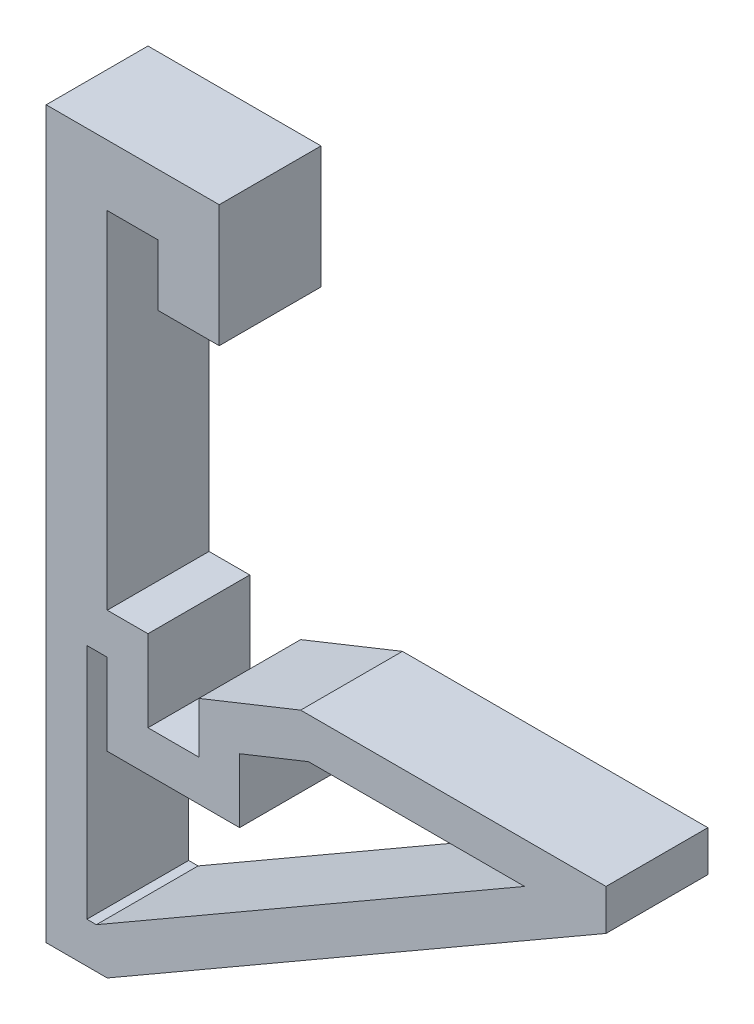
ISO-10303-21;
HEADER;
FILE_DESCRIPTION(('STEP AP214'),'2;1');
FILE_NAME('part.step','',(''),(''),'','','');
FILE_SCHEMA(('AUTOMOTIVE_DESIGN { 1 0 10303 214 1 1 1 1 }'));
ENDSEC;
DATA;
#1=APPLICATION_CONTEXT('core data for automotive mechanical design processes');
#2=APPLICATION_PROTOCOL_DEFINITION('international standard','automotive_design',2000,#1);
#3=PRODUCT_CONTEXT('',#1,'mechanical');
#4=PRODUCT('Part','Part','',(#3));
#5=PRODUCT_RELATED_PRODUCT_CATEGORY('part','',(#4));
#6=PRODUCT_DEFINITION_FORMATION('','',#4);
#7=PRODUCT_DEFINITION_CONTEXT('part definition',#1,'design');
#8=PRODUCT_DEFINITION('design','',#6,#7);
#9=PRODUCT_DEFINITION_SHAPE('','',#8);
#10=(LENGTH_UNIT() NAMED_UNIT(*) SI_UNIT(.MILLI.,.METRE.));
#11=(NAMED_UNIT(*) PLANE_ANGLE_UNIT() SI_UNIT($,.RADIAN.));
#12=(NAMED_UNIT(*) SI_UNIT($,.STERADIAN.) SOLID_ANGLE_UNIT());
#13=UNCERTAINTY_MEASURE_WITH_UNIT(LENGTH_MEASURE(1.E-05),#10,'distance_accuracy_value','');
#14=(GEOMETRIC_REPRESENTATION_CONTEXT(3) GLOBAL_UNCERTAINTY_ASSIGNED_CONTEXT((#13)) GLOBAL_UNIT_ASSIGNED_CONTEXT((#10,
#11,#12)) REPRESENTATION_CONTEXT('',''));
#15=CARTESIAN_POINT('',(0.,0.,0.));
#16=DIRECTION('',(0.,0.,1.));
#17=DIRECTION('',(1.,0.,0.));
#18=AXIS2_PLACEMENT_3D('',#15,#16,#17);
#19=CARTESIAN_POINT('',(0.,0.,5.));
#20=DIRECTION('',(0.,1.,0.));
#21=DIRECTION('',(-1.,0.,0.));
#22=AXIS2_PLACEMENT_3D('',#19,#20,#21);
#23=PLANE('',#22);
#24=DIRECTION('',(1.,0.,0.));
#25=VECTOR('',#24,1.);
#26=CARTESIAN_POINT('',(0.,0.,0.));
#27=LINE('',#26,#25);
#28=CARTESIAN_POINT('',(0.,0.,0.));
#29=VERTEX_POINT('',#28);
#30=CARTESIAN_POINT('',(3.00000000000006,-1.10561049686488E-13,0.));
#31=VERTEX_POINT('',#30);
#32=EDGE_CURVE('E264',#29,#31,#27,.T.);
#33=ORIENTED_EDGE('',*,*,#32,.T.);
#34=DIRECTION('',(0.,0.,-1.));
#35=VECTOR('',#34,1.);
#36=CARTESIAN_POINT('',(3.00000000000006,-1.10561049686488E-13,5.));
#37=LINE('',#36,#35);
#38=CARTESIAN_POINT('',(3.00000000000006,-1.10561049686488E-13,5.));
#39=VERTEX_POINT('',#38);
#40=EDGE_CURVE('E11',#39,#31,#37,.T.);
#41=ORIENTED_EDGE('',*,*,#40,.F.);
#42=DIRECTION('',(1.,0.,0.));
#43=VECTOR('',#42,1.);
#44=CARTESIAN_POINT('',(0.,0.,5.));
#45=LINE('',#44,#43);
#46=CARTESIAN_POINT('',(0.,0.,5.));
#47=VERTEX_POINT('',#46);
#48=EDGE_CURVE('E278',#47,#39,#45,.T.);
#49=ORIENTED_EDGE('',*,*,#48,.F.);
#50=DIRECTION('',(0.,0.,-1.));
#51=VECTOR('',#50,1.);
#52=CARTESIAN_POINT('',(0.,0.,5.));
#53=LINE('',#52,#51);
#54=EDGE_CURVE('E312',#47,#29,#53,.T.);
#55=ORIENTED_EDGE('',*,*,#54,.T.);
#56=EDGE_LOOP('',(#33,#41,#49,#55));
#57=FACE_BOUND('',#56,.T.);
#58=ADVANCED_FACE('F35',(#57),#23,.F.);
#59=CARTESIAN_POINT('',(3.00000000000006,-1.10561049686488E-13,5.));
#60=DIRECTION('',(-0.499999999999998,0.86602540378444,0.));
#61=DIRECTION('',(-0.86602540378444,-0.499999999999998,0.));
#62=AXIS2_PLACEMENT_3D('',#59,#60,#61);
#63=PLANE('',#62);
#64=DIRECTION('',(0.86602540378444,0.499999999999998,0.));
#65=VECTOR('',#64,1.);
#66=CARTESIAN_POINT('',(3.00000000000006,-1.10561049686488E-13,0.));
#67=LINE('',#66,#65);
#68=CARTESIAN_POINT('',(27.5000000000001,14.1450815951456,0.));
#69=VERTEX_POINT('',#68);
#70=EDGE_CURVE('E315',#31,#69,#67,.T.);
#71=ORIENTED_EDGE('',*,*,#70,.T.);
#72=DIRECTION('',(0.,0.,-1.));
#73=VECTOR('',#72,1.);
#74=CARTESIAN_POINT('',(27.5000000000001,14.1450815951456,5.));
#75=LINE('',#74,#73);
#76=CARTESIAN_POINT('',(27.5000000000001,14.1450815951456,5.));
#77=VERTEX_POINT('',#76);
#78=EDGE_CURVE('E42',#77,#69,#75,.T.);
#79=ORIENTED_EDGE('',*,*,#78,.F.);
#80=DIRECTION('',(0.86602540378444,0.499999999999998,0.));
#81=VECTOR('',#80,1.);
#82=CARTESIAN_POINT('',(3.00000000000006,-1.10561049686488E-13,5.));
#83=LINE('',#82,#81);
#84=EDGE_CURVE('E281',#39,#77,#83,.T.);
#85=ORIENTED_EDGE('',*,*,#84,.F.);
#86=ORIENTED_EDGE('',*,*,#40,.T.);
#87=EDGE_LOOP('',(#71,#79,#85,#86));
#88=FACE_BOUND('',#87,.T.);
#89=ADVANCED_FACE('F410',(#88),#63,.F.);
#90=CARTESIAN_POINT('',(27.5000000000001,16.1450815951456,5.));
#91=DIRECTION('',(-1.,0.,0.));
#92=DIRECTION('',(0.,0.,1.));
#93=AXIS2_PLACEMENT_3D('',#90,#91,#92);
#94=PLANE('',#93);
#95=DIRECTION('',(0.,1.,0.));
#96=VECTOR('',#95,1.);
#97=CARTESIAN_POINT('',(27.5000000000001,16.1450815951456,0.));
#98=LINE('',#97,#96);
#99=CARTESIAN_POINT('',(27.5000000000001,16.1450815951456,0.));
#100=VERTEX_POINT('',#99);
#101=EDGE_CURVE('E317',#69,#100,#98,.T.);
#102=ORIENTED_EDGE('',*,*,#101,.T.);
#103=DIRECTION('',(0.,0.,-1.));
#104=VECTOR('',#103,1.);
#105=CARTESIAN_POINT('',(27.5000000000001,16.1450815951456,5.));
#106=LINE('',#105,#104);
#107=CARTESIAN_POINT('',(27.5000000000001,16.1450815951456,5.));
#108=VERTEX_POINT('',#107);
#109=EDGE_CURVE('E382',#108,#100,#106,.T.);
#110=ORIENTED_EDGE('',*,*,#109,.F.);
#111=DIRECTION('',(0.,1.,0.));
#112=VECTOR('',#111,1.);
#113=CARTESIAN_POINT('',(27.5000000000001,16.1450815951456,5.));
#114=LINE('',#113,#112);
#115=EDGE_CURVE('E284',#77,#108,#114,.T.);
#116=ORIENTED_EDGE('',*,*,#115,.F.);
#117=ORIENTED_EDGE('',*,*,#78,.T.);
#118=EDGE_LOOP('',(#102,#110,#116,#117));
#119=FACE_BOUND('',#118,.T.);
#120=ADVANCED_FACE('F389',(#119),#94,.F.);
#121=CARTESIAN_POINT('',(27.5000000000001,16.1450815951456,5.));
#122=DIRECTION('',(0.,-1.,0.));
#123=DIRECTION('',(1.,0.,0.));
#124=AXIS2_PLACEMENT_3D('',#121,#122,#123);
#125=PLANE('',#124);
#126=DIRECTION('',(-1.,0.,0.));
#127=VECTOR('',#126,1.);
#128=CARTESIAN_POINT('',(27.5000000000001,16.1450815951456,0.));
#129=LINE('',#128,#127);
#130=CARTESIAN_POINT('',(12.5000000000001,16.1450815951468,0.));
#131=VERTEX_POINT('',#130);
#132=EDGE_CURVE('E319',#100,#131,#129,.T.);
#133=ORIENTED_EDGE('',*,*,#132,.T.);
#134=DIRECTION('',(0.,0.,-1.));
#135=VECTOR('',#134,1.);
#136=CARTESIAN_POINT('',(12.5000000000001,16.1450815951468,5.));
#137=LINE('',#136,#135);
#138=CARTESIAN_POINT('',(12.5000000000001,16.1450815951468,5.));
#139=VERTEX_POINT('',#138);
#140=EDGE_CURVE('E379',#139,#131,#137,.T.);
#141=ORIENTED_EDGE('',*,*,#140,.F.);
#142=DIRECTION('',(-1.,0.,0.));
#143=VECTOR('',#142,1.);
#144=CARTESIAN_POINT('',(27.5000000000001,16.1450815951456,5.));
#145=LINE('',#144,#143);
#146=EDGE_CURVE('E286',#108,#139,#145,.T.);
#147=ORIENTED_EDGE('',*,*,#146,.F.);
#148=ORIENTED_EDGE('',*,*,#109,.T.);
#149=EDGE_LOOP('',(#133,#141,#147,#148));
#150=FACE_BOUND('',#149,.T.);
#151=ADVANCED_FACE('F398',(#150),#125,.F.);
#152=CARTESIAN_POINT('',(12.5000000000001,16.1450815951468,5.));
#153=DIRECTION('',(0.371390676354282,-0.928476690885188,0.));
#154=DIRECTION('',(0.928476690885188,0.371390676354282,0.));
#155=AXIS2_PLACEMENT_3D('',#152,#153,#154);
#156=PLANE('',#155);
#157=DIRECTION('',(-0.928476690885188,-0.371390676354282,0.));
#158=VECTOR('',#157,1.);
#159=CARTESIAN_POINT('',(12.5000000000001,16.1450815951468,0.));
#160=LINE('',#159,#158);
#161=CARTESIAN_POINT('',(7.50000000000005,14.1450815951457,0.));
#162=VERTEX_POINT('',#161);
#163=EDGE_CURVE('E321',#131,#162,#160,.T.);
#164=ORIENTED_EDGE('',*,*,#163,.T.);
#165=DIRECTION('',(0.,0.,-1.));
#166=VECTOR('',#165,1.);
#167=CARTESIAN_POINT('',(7.50000000000005,14.1450815951457,5.));
#168=LINE('',#167,#166);
#169=CARTESIAN_POINT('',(7.50000000000005,14.1450815951457,5.));
#170=VERTEX_POINT('',#169);
#171=EDGE_CURVE('E376',#170,#162,#168,.T.);
#172=ORIENTED_EDGE('',*,*,#171,.F.);
#173=DIRECTION('',(-0.928476690885188,-0.371390676354282,0.));
#174=VECTOR('',#173,1.);
#175=CARTESIAN_POINT('',(12.5000000000001,16.1450815951468,5.));
#176=LINE('',#175,#174);
#177=EDGE_CURVE('E288',#139,#170,#176,.T.);
#178=ORIENTED_EDGE('',*,*,#177,.F.);
#179=ORIENTED_EDGE('',*,*,#140,.T.);
#180=EDGE_LOOP('',(#164,#172,#178,#179));
#181=FACE_BOUND('',#180,.T.);
#182=ADVANCED_FACE('F402',(#181),#156,.F.);
#183=CARTESIAN_POINT('',(7.50000000000005,14.1450815951457,5.));
#184=DIRECTION('',(1.,0.,0.));
#185=DIRECTION('',(0.,0.,-1.));
#186=AXIS2_PLACEMENT_3D('',#183,#184,#185);
#187=PLANE('',#186);
#188=DIRECTION('',(0.,-1.,0.));
#189=VECTOR('',#188,1.);
#190=CARTESIAN_POINT('',(7.50000000000005,14.1450815951457,0.));
#191=LINE('',#190,#189);
#192=CARTESIAN_POINT('',(7.50000000000005,11.6450815951457,0.));
#193=VERTEX_POINT('',#192);
#194=EDGE_CURVE('E323',#162,#193,#191,.T.);
#195=ORIENTED_EDGE('',*,*,#194,.T.);
#196=DIRECTION('',(0.,0.,-1.));
#197=VECTOR('',#196,1.);
#198=CARTESIAN_POINT('',(7.50000000000005,11.6450815951457,5.));
#199=LINE('',#198,#197);
#200=CARTESIAN_POINT('',(7.50000000000005,11.6450815951457,5.));
#201=VERTEX_POINT('',#200);
#202=EDGE_CURVE('E373',#201,#193,#199,.T.);
#203=ORIENTED_EDGE('',*,*,#202,.F.);
#204=DIRECTION('',(0.,-1.,0.));
#205=VECTOR('',#204,1.);
#206=CARTESIAN_POINT('',(7.50000000000005,14.1450815951457,5.));
#207=LINE('',#206,#205);
#208=EDGE_CURVE('E290',#170,#201,#207,.T.);
#209=ORIENTED_EDGE('',*,*,#208,.F.);
#210=ORIENTED_EDGE('',*,*,#171,.T.);
#211=EDGE_LOOP('',(#195,#203,#209,#210));
#212=FACE_BOUND('',#211,.T.);
#213=ADVANCED_FACE('F463',(#212),#187,.F.);
#214=CARTESIAN_POINT('',(7.50000000000005,11.6450815951457,5.));
#215=DIRECTION('',(0.,-1.,0.));
#216=DIRECTION('',(0.,0.,-1.));
#217=AXIS2_PLACEMENT_3D('',#214,#215,#216);
#218=PLANE('',#217);
#219=DIRECTION('',(-1.,0.,0.));
#220=VECTOR('',#219,1.);
#221=CARTESIAN_POINT('',(7.50000000000005,11.6450815951457,0.));
#222=LINE('',#221,#220);
#223=CARTESIAN_POINT('',(5.00000000000005,11.6450815951457,0.));
#224=VERTEX_POINT('',#223);
#225=EDGE_CURVE('E325',#193,#224,#222,.T.);
#226=ORIENTED_EDGE('',*,*,#225,.T.);
#227=DIRECTION('',(0.,0.,-1.));
#228=VECTOR('',#227,1.);
#229=CARTESIAN_POINT('',(5.00000000000005,11.6450815951457,5.));
#230=LINE('',#229,#228);
#231=CARTESIAN_POINT('',(5.00000000000005,11.6450815951457,5.));
#232=VERTEX_POINT('',#231);
#233=EDGE_CURVE('E370',#232,#224,#230,.T.);
#234=ORIENTED_EDGE('',*,*,#233,.F.);
#235=DIRECTION('',(-1.,0.,0.));
#236=VECTOR('',#235,1.);
#237=CARTESIAN_POINT('',(7.50000000000005,11.6450815951457,5.));
#238=LINE('',#237,#236);
#239=EDGE_CURVE('E292',#201,#232,#238,.T.);
#240=ORIENTED_EDGE('',*,*,#239,.F.);
#241=ORIENTED_EDGE('',*,*,#202,.T.);
#242=EDGE_LOOP('',(#226,#234,#240,#241));
#243=FACE_BOUND('',#242,.T.);
#244=ADVANCED_FACE('F460',(#243),#218,.F.);
#245=CARTESIAN_POINT('',(5.00000000000005,11.6450815951457,5.));
#246=DIRECTION('',(-1.,0.,0.));
#247=DIRECTION('',(0.,-1.,0.));
#248=AXIS2_PLACEMENT_3D('',#245,#246,#247);
#249=PLANE('',#248);
#250=DIRECTION('',(0.,1.,0.));
#251=VECTOR('',#250,1.);
#252=CARTESIAN_POINT('',(5.00000000000005,11.6450815951457,0.));
#253=LINE('',#252,#251);
#254=CARTESIAN_POINT('',(5.00000000000005,15.6450815951457,0.));
#255=VERTEX_POINT('',#254);
#256=EDGE_CURVE('E327',#224,#255,#253,.T.);
#257=ORIENTED_EDGE('',*,*,#256,.T.);
#258=DIRECTION('',(0.,0.,-1.));
#259=VECTOR('',#258,1.);
#260=CARTESIAN_POINT('',(5.00000000000005,15.6450815951457,5.));
#261=LINE('',#260,#259);
#262=CARTESIAN_POINT('',(5.00000000000005,15.6450815951457,5.));
#263=VERTEX_POINT('',#262);
#264=EDGE_CURVE('E367',#263,#255,#261,.T.);
#265=ORIENTED_EDGE('',*,*,#264,.F.);
#266=DIRECTION('',(0.,1.,0.));
#267=VECTOR('',#266,1.);
#268=CARTESIAN_POINT('',(5.00000000000005,11.6450815951457,5.));
#269=LINE('',#268,#267);
#270=EDGE_CURVE('E294',#232,#263,#269,.T.);
#271=ORIENTED_EDGE('',*,*,#270,.F.);
#272=ORIENTED_EDGE('',*,*,#233,.T.);
#273=EDGE_LOOP('',(#257,#265,#271,#272));
#274=FACE_BOUND('',#273,.T.);
#275=ADVANCED_FACE('F456',(#274),#249,.F.);
#276=CARTESIAN_POINT('',(5.00000000000005,15.6450815951457,5.));
#277=DIRECTION('',(0.,-1.,0.));
#278=DIRECTION('',(0.,0.,-1.));
#279=AXIS2_PLACEMENT_3D('',#276,#277,#278);
#280=PLANE('',#279);
#281=DIRECTION('',(-1.,0.,0.));
#282=VECTOR('',#281,1.);
#283=CARTESIAN_POINT('',(5.00000000000005,15.6450815951457,0.));
#284=LINE('',#283,#282);
#285=CARTESIAN_POINT('',(3.00000000000005,15.6450815951457,0.));
#286=VERTEX_POINT('',#285);
#287=EDGE_CURVE('E329',#255,#286,#284,.T.);
#288=ORIENTED_EDGE('',*,*,#287,.T.);
#289=DIRECTION('',(0.,0.,-1.));
#290=VECTOR('',#289,1.);
#291=CARTESIAN_POINT('',(3.00000000000005,15.6450815951457,5.));
#292=LINE('',#291,#290);
#293=CARTESIAN_POINT('',(3.00000000000005,15.6450815951457,5.));
#294=VERTEX_POINT('',#293);
#295=EDGE_CURVE('E364',#294,#286,#292,.T.);
#296=ORIENTED_EDGE('',*,*,#295,.F.);
#297=DIRECTION('',(-1.,0.,0.));
#298=VECTOR('',#297,1.);
#299=CARTESIAN_POINT('',(5.00000000000005,15.6450815951457,5.));
#300=LINE('',#299,#298);
#301=EDGE_CURVE('E296',#263,#294,#300,.T.);
#302=ORIENTED_EDGE('',*,*,#301,.F.);
#303=ORIENTED_EDGE('',*,*,#264,.T.);
#304=EDGE_LOOP('',(#288,#296,#302,#303));
#305=FACE_BOUND('',#304,.T.);
#306=ADVANCED_FACE('F452',(#305),#280,.F.);
#307=CARTESIAN_POINT('',(3.00000000000005,32.6450815951457,5.));
#308=DIRECTION('',(-1.,0.,0.));
#309=DIRECTION('',(0.,-1.,0.));
#310=AXIS2_PLACEMENT_3D('',#307,#308,#309);
#311=PLANE('',#310);
#312=DIRECTION('',(0.,1.,0.));
#313=VECTOR('',#312,1.);
#314=CARTESIAN_POINT('',(3.00000000000005,32.6450815951457,0.));
#315=LINE('',#314,#313);
#316=CARTESIAN_POINT('',(3.00000000000005,32.6450815951457,0.));
#317=VERTEX_POINT('',#316);
#318=EDGE_CURVE('E331',#286,#317,#315,.T.);
#319=ORIENTED_EDGE('',*,*,#318,.T.);
#320=DIRECTION('',(0.,0.,-1.));
#321=VECTOR('',#320,1.);
#322=CARTESIAN_POINT('',(3.00000000000005,32.6450815951457,5.));
#323=LINE('',#322,#321);
#324=CARTESIAN_POINT('',(3.00000000000005,32.6450815951457,5.));
#325=VERTEX_POINT('',#324);
#326=EDGE_CURVE('E361',#325,#317,#323,.T.);
#327=ORIENTED_EDGE('',*,*,#326,.F.);
#328=DIRECTION('',(0.,1.,0.));
#329=VECTOR('',#328,1.);
#330=CARTESIAN_POINT('',(3.00000000000005,32.6450815951457,5.));
#331=LINE('',#330,#329);
#332=EDGE_CURVE('E298',#294,#325,#331,.T.);
#333=ORIENTED_EDGE('',*,*,#332,.F.);
#334=ORIENTED_EDGE('',*,*,#295,.T.);
#335=EDGE_LOOP('',(#319,#327,#333,#334));
#336=FACE_BOUND('',#335,.T.);
#337=ADVANCED_FACE('F447',(#336),#311,.F.);
#338=CARTESIAN_POINT('',(5.50000000000006,32.6450815951457,5.));
#339=DIRECTION('',(0.,1.,0.));
#340=DIRECTION('',(0.,0.,1.));
#341=AXIS2_PLACEMENT_3D('',#338,#339,#340);
#342=PLANE('',#341);
#343=DIRECTION('',(1.,0.,0.));
#344=VECTOR('',#343,1.);
#345=CARTESIAN_POINT('',(5.50000000000006,32.6450815951457,0.));
#346=LINE('',#345,#344);
#347=CARTESIAN_POINT('',(5.50000000000006,32.6450815951457,0.));
#348=VERTEX_POINT('',#347);
#349=EDGE_CURVE('E333',#317,#348,#346,.T.);
#350=ORIENTED_EDGE('',*,*,#349,.T.);
#351=DIRECTION('',(0.,0.,-1.));
#352=VECTOR('',#351,1.);
#353=CARTESIAN_POINT('',(5.50000000000006,32.6450815951457,5.));
#354=LINE('',#353,#352);
#355=CARTESIAN_POINT('',(5.50000000000006,32.6450815951457,5.));
#356=VERTEX_POINT('',#355);
#357=EDGE_CURVE('E358',#356,#348,#354,.T.);
#358=ORIENTED_EDGE('',*,*,#357,.F.);
#359=DIRECTION('',(1.,0.,0.));
#360=VECTOR('',#359,1.);
#361=CARTESIAN_POINT('',(5.50000000000006,32.6450815951457,5.));
#362=LINE('',#361,#360);
#363=EDGE_CURVE('E300',#325,#356,#362,.T.);
#364=ORIENTED_EDGE('',*,*,#363,.F.);
#365=ORIENTED_EDGE('',*,*,#326,.T.);
#366=EDGE_LOOP('',(#350,#358,#364,#365));
#367=FACE_BOUND('',#366,.T.);
#368=ADVANCED_FACE('F441',(#367),#342,.F.);
#369=CARTESIAN_POINT('',(5.50000000000005,29.6450815951457,5.));
#370=DIRECTION('',(1.,0.,0.));
#371=DIRECTION('',(0.,1.,0.));
#372=AXIS2_PLACEMENT_3D('',#369,#370,#371);
#373=PLANE('',#372);
#374=DIRECTION('',(0.,-1.,0.));
#375=VECTOR('',#374,1.);
#376=CARTESIAN_POINT('',(5.50000000000005,29.6450815951457,0.));
#377=LINE('',#376,#375);
#378=CARTESIAN_POINT('',(5.50000000000005,29.6450815951457,0.));
#379=VERTEX_POINT('',#378);
#380=EDGE_CURVE('E335',#348,#379,#377,.T.);
#381=ORIENTED_EDGE('',*,*,#380,.T.);
#382=DIRECTION('',(0.,0.,-1.));
#383=VECTOR('',#382,1.);
#384=CARTESIAN_POINT('',(5.50000000000005,29.6450815951457,5.));
#385=LINE('',#384,#383);
#386=CARTESIAN_POINT('',(5.50000000000005,29.6450815951457,5.));
#387=VERTEX_POINT('',#386);
#388=EDGE_CURVE('E355',#387,#379,#385,.T.);
#389=ORIENTED_EDGE('',*,*,#388,.F.);
#390=DIRECTION('',(0.,-1.,0.));
#391=VECTOR('',#390,1.);
#392=CARTESIAN_POINT('',(5.50000000000005,29.6450815951457,5.));
#393=LINE('',#392,#391);
#394=EDGE_CURVE('E302',#356,#387,#393,.T.);
#395=ORIENTED_EDGE('',*,*,#394,.F.);
#396=ORIENTED_EDGE('',*,*,#357,.T.);
#397=EDGE_LOOP('',(#381,#389,#395,#396));
#398=FACE_BOUND('',#397,.T.);
#399=ADVANCED_FACE('F437',(#398),#373,.F.);
#400=CARTESIAN_POINT('',(8.50000000000006,29.6450815951457,5.));
#401=DIRECTION('',(0.,1.,0.));
#402=DIRECTION('',(0.,0.,1.));
#403=AXIS2_PLACEMENT_3D('',#400,#401,#402);
#404=PLANE('',#403);
#405=DIRECTION('',(1.,0.,0.));
#406=VECTOR('',#405,1.);
#407=CARTESIAN_POINT('',(8.50000000000006,29.6450815951457,0.));
#408=LINE('',#407,#406);
#409=CARTESIAN_POINT('',(8.50000000000006,29.6450815951457,0.));
#410=VERTEX_POINT('',#409);
#411=EDGE_CURVE('E337',#379,#410,#408,.T.);
#412=ORIENTED_EDGE('',*,*,#411,.T.);
#413=DIRECTION('',(0.,0.,-1.));
#414=VECTOR('',#413,1.);
#415=CARTESIAN_POINT('',(8.50000000000006,29.6450815951457,5.));
#416=LINE('',#415,#414);
#417=CARTESIAN_POINT('',(8.50000000000006,29.6450815951457,5.));
#418=VERTEX_POINT('',#417);
#419=EDGE_CURVE('E352',#418,#410,#416,.T.);
#420=ORIENTED_EDGE('',*,*,#419,.F.);
#421=DIRECTION('',(1.,0.,0.));
#422=VECTOR('',#421,1.);
#423=CARTESIAN_POINT('',(8.50000000000006,29.6450815951457,5.));
#424=LINE('',#423,#422);
#425=EDGE_CURVE('E304',#387,#418,#424,.T.);
#426=ORIENTED_EDGE('',*,*,#425,.F.);
#427=ORIENTED_EDGE('',*,*,#388,.T.);
#428=EDGE_LOOP('',(#412,#420,#426,#427));
#429=FACE_BOUND('',#428,.T.);
#430=ADVANCED_FACE('F432',(#429),#404,.F.);
#431=CARTESIAN_POINT('',(8.50000000000006,35.6450815951456,5.));
#432=DIRECTION('',(-1.,0.,0.));
#433=DIRECTION('',(0.,0.,1.));
#434=AXIS2_PLACEMENT_3D('',#431,#432,#433);
#435=PLANE('',#434);
#436=DIRECTION('',(0.,1.,0.));
#437=VECTOR('',#436,1.);
#438=CARTESIAN_POINT('',(8.50000000000006,35.6450815951456,0.));
#439=LINE('',#438,#437);
#440=CARTESIAN_POINT('',(8.50000000000006,35.6450815951456,0.));
#441=VERTEX_POINT('',#440);
#442=EDGE_CURVE('E339',#410,#441,#439,.T.);
#443=ORIENTED_EDGE('',*,*,#442,.T.);
#444=DIRECTION('',(0.,0.,-1.));
#445=VECTOR('',#444,1.);
#446=CARTESIAN_POINT('',(8.50000000000006,35.6450815951456,5.));
#447=LINE('',#446,#445);
#448=CARTESIAN_POINT('',(8.50000000000006,35.6450815951456,5.));
#449=VERTEX_POINT('',#448);
#450=EDGE_CURVE('E349',#449,#441,#447,.T.);
#451=ORIENTED_EDGE('',*,*,#450,.F.);
#452=DIRECTION('',(0.,1.,0.));
#453=VECTOR('',#452,1.);
#454=CARTESIAN_POINT('',(8.50000000000006,35.6450815951456,5.));
#455=LINE('',#454,#453);
#456=EDGE_CURVE('E306',#418,#449,#455,.T.);
#457=ORIENTED_EDGE('',*,*,#456,.F.);
#458=ORIENTED_EDGE('',*,*,#419,.T.);
#459=EDGE_LOOP('',(#443,#451,#457,#458));
#460=FACE_BOUND('',#459,.T.);
#461=ADVANCED_FACE('F426',(#460),#435,.F.);
#462=CARTESIAN_POINT('',(0.,35.6450815951456,5.));
#463=DIRECTION('',(0.,-1.,0.));
#464=DIRECTION('',(0.,0.,-1.));
#465=AXIS2_PLACEMENT_3D('',#462,#463,#464);
#466=PLANE('',#465);
#467=DIRECTION('',(-1.,0.,0.));
#468=VECTOR('',#467,1.);
#469=CARTESIAN_POINT('',(0.,35.6450815951456,0.));
#470=LINE('',#469,#468);
#471=CARTESIAN_POINT('',(0.,35.6450815951456,0.));
#472=VERTEX_POINT('',#471);
#473=EDGE_CURVE('E341',#441,#472,#470,.T.);
#474=ORIENTED_EDGE('',*,*,#473,.T.);
#475=DIRECTION('',(0.,0.,-1.));
#476=VECTOR('',#475,1.);
#477=CARTESIAN_POINT('',(0.,35.6450815951456,5.));
#478=LINE('',#477,#476);
#479=CARTESIAN_POINT('',(0.,35.6450815951456,5.));
#480=VERTEX_POINT('',#479);
#481=EDGE_CURVE('E346',#480,#472,#478,.T.);
#482=ORIENTED_EDGE('',*,*,#481,.F.);
#483=DIRECTION('',(-1.,0.,0.));
#484=VECTOR('',#483,1.);
#485=CARTESIAN_POINT('',(0.,35.6450815951456,5.));
#486=LINE('',#485,#484);
#487=EDGE_CURVE('E308',#449,#480,#486,.T.);
#488=ORIENTED_EDGE('',*,*,#487,.F.);
#489=ORIENTED_EDGE('',*,*,#450,.T.);
#490=EDGE_LOOP('',(#474,#482,#488,#489));
#491=FACE_BOUND('',#490,.T.);
#492=ADVANCED_FACE('F422',(#491),#466,.F.);
#493=CARTESIAN_POINT('',(0.,0.,5.));
#494=DIRECTION('',(1.,0.,0.));
#495=DIRECTION('',(0.,0.,-1.));
#496=AXIS2_PLACEMENT_3D('',#493,#494,#495);
#497=PLANE('',#496);
#498=DIRECTION('',(0.,-1.,0.));
#499=VECTOR('',#498,1.);
#500=CARTESIAN_POINT('',(0.,0.,0.));
#501=LINE('',#500,#499);
#502=EDGE_CURVE('E282',#472,#29,#501,.T.);
#503=ORIENTED_EDGE('',*,*,#502,.T.);
#504=ORIENTED_EDGE('',*,*,#54,.F.);
#505=DIRECTION('',(0.,-1.,0.));
#506=VECTOR('',#505,1.);
#507=CARTESIAN_POINT('',(0.,0.,5.));
#508=LINE('',#507,#506);
#509=EDGE_CURVE('E310',#480,#47,#508,.T.);
#510=ORIENTED_EDGE('',*,*,#509,.F.);
#511=ORIENTED_EDGE('',*,*,#481,.T.);
#512=EDGE_LOOP('',(#503,#504,#510,#511));
#513=FACE_BOUND('',#512,.T.);
#514=ADVANCED_FACE('F417',(#513),#497,.F.);
#515=CARTESIAN_POINT('',(0.,0.,5.));
#516=DIRECTION('',(0.,0.,-1.));
#517=DIRECTION('',(-1.,0.,0.));
#518=AXIS2_PLACEMENT_3D('',#515,#516,#517);
#519=PLANE('',#518);
#520=DIRECTION('',(1.,-1.22413264649677E-13,0.));
#521=VECTOR('',#520,1.);
#522=CARTESIAN_POINT('',(2.,1.99999999999975,5.));
#523=LINE('',#522,#521);
#524=CARTESIAN_POINT('',(2.,1.99999999999975,5.));
#525=VERTEX_POINT('',#524);
#526=CARTESIAN_POINT('',(2.46410161513808,1.9999999999997,5.));
#527=VERTEX_POINT('',#526);
#528=EDGE_CURVE('E243',#525,#527,#523,.T.);
#529=ORIENTED_EDGE('',*,*,#528,.F.);
#530=DIRECTION('',(0.,-1.,0.));
#531=VECTOR('',#530,1.);
#532=CARTESIAN_POINT('',(2.,13.6450815951457,5.));
#533=LINE('',#532,#531);
#534=CARTESIAN_POINT('',(2.,13.6450815951457,5.));
#535=VERTEX_POINT('',#534);
#536=EDGE_CURVE('E49',#535,#525,#533,.T.);
#537=ORIENTED_EDGE('',*,*,#536,.F.);
#538=DIRECTION('',(-1.,0.,0.));
#539=VECTOR('',#538,1.);
#540=CARTESIAN_POINT('',(3.00000000000005,13.6450815951457,5.));
#541=LINE('',#540,#539);
#542=CARTESIAN_POINT('',(3.00000000000005,13.6450815951457,5.));
#543=VERTEX_POINT('',#542);
#544=EDGE_CURVE('E220',#543,#535,#541,.T.);
#545=ORIENTED_EDGE('',*,*,#544,.F.);
#546=DIRECTION('',(0.,1.,0.));
#547=VECTOR('',#546,1.);
#548=CARTESIAN_POINT('',(3.00000000000005,9.64508159514565,5.));
#549=LINE('',#548,#547);
#550=CARTESIAN_POINT('',(3.00000000000005,9.64508159514565,5.));
#551=VERTEX_POINT('',#550);
#552=EDGE_CURVE('E223',#551,#543,#549,.T.);
#553=ORIENTED_EDGE('',*,*,#552,.F.);
#554=DIRECTION('',(-1.,0.,0.));
#555=VECTOR('',#554,1.);
#556=CARTESIAN_POINT('',(9.50000000000005,9.64508159514565,5.));
#557=LINE('',#556,#555);
#558=CARTESIAN_POINT('',(9.50000000000005,9.64508159514565,5.));
#559=VERTEX_POINT('',#558);
#560=EDGE_CURVE('E257',#559,#551,#557,.T.);
#561=ORIENTED_EDGE('',*,*,#560,.F.);
#562=DIRECTION('',(0.,-1.,0.));
#563=VECTOR('',#562,1.);
#564=CARTESIAN_POINT('',(9.50000000000005,12.7910156722921,5.));
#565=LINE('',#564,#563);
#566=CARTESIAN_POINT('',(9.50000000000005,12.7910156722921,5.));
#567=VERTEX_POINT('',#566);
#568=EDGE_CURVE('E254',#567,#559,#565,.T.);
#569=ORIENTED_EDGE('',*,*,#568,.F.);
#570=DIRECTION('',(-0.928476690885188,-0.371390676354282,0.));
#571=VECTOR('',#570,1.);
#572=CARTESIAN_POINT('',(12.8851648071347,14.1450815951467,5.));
#573=LINE('',#572,#571);
#574=CARTESIAN_POINT('',(12.8851648071347,14.1450815951467,5.));
#575=VERTEX_POINT('',#574);
#576=EDGE_CURVE('E251',#575,#567,#573,.T.);
#577=ORIENTED_EDGE('',*,*,#576,.F.);
#578=DIRECTION('',(-1.,0.,0.));
#579=VECTOR('',#578,1.);
#580=CARTESIAN_POINT('',(23.5000000000006,14.1450815951459,5.));
#581=LINE('',#580,#579);
#582=CARTESIAN_POINT('',(23.5000000000006,14.1450815951459,5.));
#583=VERTEX_POINT('',#582);
#584=EDGE_CURVE('E248',#583,#575,#581,.T.);
#585=ORIENTED_EDGE('',*,*,#584,.F.);
#586=DIRECTION('',(0.866025403784433,0.500000000000009,0.));
#587=VECTOR('',#586,1.);
#588=CARTESIAN_POINT('',(2.46410161513808,1.9999999999997,5.));
#589=LINE('',#588,#587);
#590=EDGE_CURVE('E245',#527,#583,#589,.T.);
#591=ORIENTED_EDGE('',*,*,#590,.F.);
#592=EDGE_LOOP('',(#529,#537,#545,#553,#561,#569,#577,#585,#591));
#593=FACE_BOUND('',#592,.T.);
#594=ORIENTED_EDGE('',*,*,#48,.T.);
#595=ORIENTED_EDGE('',*,*,#84,.T.);
#596=ORIENTED_EDGE('',*,*,#115,.T.);
#597=ORIENTED_EDGE('',*,*,#146,.T.);
#598=ORIENTED_EDGE('',*,*,#177,.T.);
#599=ORIENTED_EDGE('',*,*,#208,.T.);
#600=ORIENTED_EDGE('',*,*,#239,.T.);
#601=ORIENTED_EDGE('',*,*,#270,.T.);
#602=ORIENTED_EDGE('',*,*,#301,.T.);
#603=ORIENTED_EDGE('',*,*,#332,.T.);
#604=ORIENTED_EDGE('',*,*,#363,.T.);
#605=ORIENTED_EDGE('',*,*,#394,.T.);
#606=ORIENTED_EDGE('',*,*,#425,.T.);
#607=ORIENTED_EDGE('',*,*,#456,.T.);
#608=ORIENTED_EDGE('',*,*,#487,.T.);
#609=ORIENTED_EDGE('',*,*,#509,.T.);
#610=EDGE_LOOP('',(#594,#595,#596,#597,#598,#599,#600,#601,#602,#603,#604,#605,#606,#607,#608,#609));
#611=FACE_BOUND('',#610,.T.);
#612=ADVANCED_FACE('F406',(#593,#611),#519,.F.);
#613=CARTESIAN_POINT('',(0.,0.,0.));
#614=DIRECTION('',(0.,0.,-1.));
#615=DIRECTION('',(-1.,0.,0.));
#616=AXIS2_PLACEMENT_3D('',#613,#614,#615);
#617=PLANE('',#616);
#618=DIRECTION('',(0.,-1.,0.));
#619=VECTOR('',#618,1.);
#620=CARTESIAN_POINT('',(2.,13.6450815951457,0.));
#621=LINE('',#620,#619);
#622=CARTESIAN_POINT('',(2.,13.6450815951457,0.));
#623=VERTEX_POINT('',#622);
#624=CARTESIAN_POINT('',(2.,1.99999999999975,0.));
#625=VERTEX_POINT('',#624);
#626=EDGE_CURVE('E203',#623,#625,#621,.T.);
#627=ORIENTED_EDGE('',*,*,#626,.T.);
#628=DIRECTION('',(1.,-1.22413264649677E-13,0.));
#629=VECTOR('',#628,1.);
#630=CARTESIAN_POINT('',(2.,1.99999999999975,0.));
#631=LINE('',#630,#629);
#632=CARTESIAN_POINT('',(2.46410161513808,1.9999999999997,0.));
#633=VERTEX_POINT('',#632);
#634=EDGE_CURVE('E212',#625,#633,#631,.T.);
#635=ORIENTED_EDGE('',*,*,#634,.T.);
#636=DIRECTION('',(0.866025403784433,0.500000000000009,0.));
#637=VECTOR('',#636,1.);
#638=CARTESIAN_POINT('',(2.46410161513808,1.9999999999997,0.));
#639=LINE('',#638,#637);
#640=CARTESIAN_POINT('',(23.5000000000006,14.1450815951459,0.));
#641=VERTEX_POINT('',#640);
#642=EDGE_CURVE('E57',#633,#641,#639,.T.);
#643=ORIENTED_EDGE('',*,*,#642,.T.);
#644=DIRECTION('',(-1.,0.,0.));
#645=VECTOR('',#644,1.);
#646=CARTESIAN_POINT('',(23.5000000000006,14.1450815951459,0.));
#647=LINE('',#646,#645);
#648=CARTESIAN_POINT('',(12.8851648071347,14.1450815951467,0.));
#649=VERTEX_POINT('',#648);
#650=EDGE_CURVE('E227',#641,#649,#647,.T.);
#651=ORIENTED_EDGE('',*,*,#650,.T.);
#652=DIRECTION('',(-0.928476690885188,-0.371390676354282,0.));
#653=VECTOR('',#652,1.);
#654=CARTESIAN_POINT('',(12.8851648071347,14.1450815951467,0.));
#655=LINE('',#654,#653);
#656=CARTESIAN_POINT('',(9.50000000000005,12.7910156722921,0.));
#657=VERTEX_POINT('',#656);
#658=EDGE_CURVE('E230',#649,#657,#655,.T.);
#659=ORIENTED_EDGE('',*,*,#658,.T.);
#660=DIRECTION('',(0.,-1.,0.));
#661=VECTOR('',#660,1.);
#662=CARTESIAN_POINT('',(9.50000000000005,12.7910156722921,0.));
#663=LINE('',#662,#661);
#664=CARTESIAN_POINT('',(9.50000000000005,9.64508159514565,0.));
#665=VERTEX_POINT('',#664);
#666=EDGE_CURVE('E233',#657,#665,#663,.T.);
#667=ORIENTED_EDGE('',*,*,#666,.T.);
#668=DIRECTION('',(-1.,0.,0.));
#669=VECTOR('',#668,1.);
#670=CARTESIAN_POINT('',(9.50000000000005,9.64508159514565,0.));
#671=LINE('',#670,#669);
#672=CARTESIAN_POINT('',(3.00000000000005,9.64508159514565,0.));
#673=VERTEX_POINT('',#672);
#674=EDGE_CURVE('E236',#665,#673,#671,.T.);
#675=ORIENTED_EDGE('',*,*,#674,.T.);
#676=DIRECTION('',(0.,1.,0.));
#677=VECTOR('',#676,1.);
#678=CARTESIAN_POINT('',(3.00000000000005,9.64508159514565,0.));
#679=LINE('',#678,#677);
#680=CARTESIAN_POINT('',(3.00000000000005,13.6450815951457,0.));
#681=VERTEX_POINT('',#680);
#682=EDGE_CURVE('E239',#673,#681,#679,.T.);
#683=ORIENTED_EDGE('',*,*,#682,.T.);
#684=DIRECTION('',(-1.,0.,0.));
#685=VECTOR('',#684,1.);
#686=CARTESIAN_POINT('',(3.00000000000005,13.6450815951457,0.));
#687=LINE('',#686,#685);
#688=EDGE_CURVE('E209',#681,#623,#687,.T.);
#689=ORIENTED_EDGE('',*,*,#688,.T.);
#690=EDGE_LOOP('',(#627,#635,#643,#651,#659,#667,#675,#683,#689));
#691=FACE_BOUND('',#690,.T.);
#692=ORIENTED_EDGE('',*,*,#32,.F.);
#693=ORIENTED_EDGE('',*,*,#502,.F.);
#694=ORIENTED_EDGE('',*,*,#473,.F.);
#695=ORIENTED_EDGE('',*,*,#442,.F.);
#696=ORIENTED_EDGE('',*,*,#411,.F.);
#697=ORIENTED_EDGE('',*,*,#380,.F.);
#698=ORIENTED_EDGE('',*,*,#349,.F.);
#699=ORIENTED_EDGE('',*,*,#318,.F.);
#700=ORIENTED_EDGE('',*,*,#287,.F.);
#701=ORIENTED_EDGE('',*,*,#256,.F.);
#702=ORIENTED_EDGE('',*,*,#225,.F.);
#703=ORIENTED_EDGE('',*,*,#194,.F.);
#704=ORIENTED_EDGE('',*,*,#163,.F.);
#705=ORIENTED_EDGE('',*,*,#132,.F.);
#706=ORIENTED_EDGE('',*,*,#101,.F.);
#707=ORIENTED_EDGE('',*,*,#70,.F.);
#708=EDGE_LOOP('',(#692,#693,#694,#695,#696,#697,#698,#699,#700,#701,#702,#703,#704,#705,#706,#707));
#709=FACE_BOUND('',#708,.T.);
#710=ADVANCED_FACE('F216',(#691,#709),#617,.T.);
#711=CARTESIAN_POINT('',(2.,13.6450815951457,0.));
#712=DIRECTION('',(-1.,0.,0.));
#713=DIRECTION('',(0.,0.,1.));
#714=AXIS2_PLACEMENT_3D('',#711,#712,#713);
#715=PLANE('',#714);
#716=ORIENTED_EDGE('',*,*,#536,.T.);
#717=DIRECTION('',(0.,0.,1.));
#718=VECTOR('',#717,1.);
#719=CARTESIAN_POINT('',(2.,1.99999999999975,0.));
#720=LINE('',#719,#718);
#721=EDGE_CURVE('E199',#625,#525,#720,.T.);
#722=ORIENTED_EDGE('',*,*,#721,.F.);
#723=ORIENTED_EDGE('',*,*,#626,.F.);
#724=DIRECTION('',(0.,0.,1.));
#725=VECTOR('',#724,1.);
#726=CARTESIAN_POINT('',(2.,13.6450815951457,0.));
#727=LINE('',#726,#725);
#728=EDGE_CURVE('E262',#623,#535,#727,.T.);
#729=ORIENTED_EDGE('',*,*,#728,.T.);
#730=EDGE_LOOP('',(#716,#722,#723,#729));
#731=FACE_BOUND('',#730,.T.);
#732=ADVANCED_FACE('F201',(#731),#715,.F.);
#733=CARTESIAN_POINT('',(3.00000000000005,13.6450815951457,0.));
#734=DIRECTION('',(0.,1.,0.));
#735=DIRECTION('',(-1.,0.,0.));
#736=AXIS2_PLACEMENT_3D('',#733,#734,#735);
#737=PLANE('',#736);
#738=ORIENTED_EDGE('',*,*,#544,.T.);
#739=ORIENTED_EDGE('',*,*,#728,.F.);
#740=ORIENTED_EDGE('',*,*,#688,.F.);
#741=DIRECTION('',(0.,0.,1.));
#742=VECTOR('',#741,1.);
#743=CARTESIAN_POINT('',(3.00000000000005,13.6450815951457,0.));
#744=LINE('',#743,#742);
#745=EDGE_CURVE('E265',#681,#543,#744,.T.);
#746=ORIENTED_EDGE('',*,*,#745,.T.);
#747=EDGE_LOOP('',(#738,#739,#740,#746));
#748=FACE_BOUND('',#747,.T.);
#749=ADVANCED_FACE('F598',(#748),#737,.F.);
#750=CARTESIAN_POINT('',(3.00000000000005,9.64508159514565,0.));
#751=DIRECTION('',(1.,0.,0.));
#752=DIRECTION('',(0.,1.,0.));
#753=AXIS2_PLACEMENT_3D('',#750,#751,#752);
#754=PLANE('',#753);
#755=ORIENTED_EDGE('',*,*,#552,.T.);
#756=ORIENTED_EDGE('',*,*,#745,.F.);
#757=ORIENTED_EDGE('',*,*,#682,.F.);
#758=DIRECTION('',(0.,0.,1.));
#759=VECTOR('',#758,1.);
#760=CARTESIAN_POINT('',(3.00000000000005,9.64508159514565,0.));
#761=LINE('',#760,#759);
#762=EDGE_CURVE('E267',#673,#551,#761,.T.);
#763=ORIENTED_EDGE('',*,*,#762,.T.);
#764=EDGE_LOOP('',(#755,#756,#757,#763));
#765=FACE_BOUND('',#764,.T.);
#766=ADVANCED_FACE('F607',(#765),#754,.F.);
#767=CARTESIAN_POINT('',(9.50000000000005,9.64508159514565,0.));
#768=DIRECTION('',(0.,1.,0.));
#769=DIRECTION('',(0.,0.,1.));
#770=AXIS2_PLACEMENT_3D('',#767,#768,#769);
#771=PLANE('',#770);
#772=ORIENTED_EDGE('',*,*,#560,.T.);
#773=ORIENTED_EDGE('',*,*,#762,.F.);
#774=ORIENTED_EDGE('',*,*,#674,.F.);
#775=DIRECTION('',(0.,0.,1.));
#776=VECTOR('',#775,1.);
#777=CARTESIAN_POINT('',(9.50000000000005,9.64508159514565,0.));
#778=LINE('',#777,#776);
#779=EDGE_CURVE('E269',#665,#559,#778,.T.);
#780=ORIENTED_EDGE('',*,*,#779,.T.);
#781=EDGE_LOOP('',(#772,#773,#774,#780));
#782=FACE_BOUND('',#781,.T.);
#783=ADVANCED_FACE('F617',(#782),#771,.F.);
#784=CARTESIAN_POINT('',(9.50000000000005,12.7910156722921,0.));
#785=DIRECTION('',(-1.,0.,0.));
#786=DIRECTION('',(0.,0.,1.));
#787=AXIS2_PLACEMENT_3D('',#784,#785,#786);
#788=PLANE('',#787);
#789=ORIENTED_EDGE('',*,*,#568,.T.);
#790=ORIENTED_EDGE('',*,*,#779,.F.);
#791=ORIENTED_EDGE('',*,*,#666,.F.);
#792=DIRECTION('',(0.,0.,1.));
#793=VECTOR('',#792,1.);
#794=CARTESIAN_POINT('',(9.50000000000005,12.7910156722921,0.));
#795=LINE('',#794,#793);
#796=EDGE_CURVE('E271',#657,#567,#795,.T.);
#797=ORIENTED_EDGE('',*,*,#796,.T.);
#798=EDGE_LOOP('',(#789,#790,#791,#797));
#799=FACE_BOUND('',#798,.T.);
#800=ADVANCED_FACE('F627',(#799),#788,.F.);
#801=CARTESIAN_POINT('',(12.8851648071347,14.1450815951467,0.));
#802=DIRECTION('',(-0.371390676354282,0.928476690885188,0.));
#803=DIRECTION('',(-0.928476690885188,-0.371390676354282,0.));
#804=AXIS2_PLACEMENT_3D('',#801,#802,#803);
#805=PLANE('',#804);
#806=ORIENTED_EDGE('',*,*,#576,.T.);
#807=ORIENTED_EDGE('',*,*,#796,.F.);
#808=ORIENTED_EDGE('',*,*,#658,.F.);
#809=DIRECTION('',(0.,0.,1.));
#810=VECTOR('',#809,1.);
#811=CARTESIAN_POINT('',(12.8851648071347,14.1450815951467,0.));
#812=LINE('',#811,#810);
#813=EDGE_CURVE('E273',#649,#575,#812,.T.);
#814=ORIENTED_EDGE('',*,*,#813,.T.);
#815=EDGE_LOOP('',(#806,#807,#808,#814));
#816=FACE_BOUND('',#815,.T.);
#817=ADVANCED_FACE('F637',(#816),#805,.F.);
#818=CARTESIAN_POINT('',(23.5000000000006,14.1450815951459,0.));
#819=DIRECTION('',(0.,1.,0.));
#820=DIRECTION('',(-1.,0.,0.));
#821=AXIS2_PLACEMENT_3D('',#818,#819,#820);
#822=PLANE('',#821);
#823=ORIENTED_EDGE('',*,*,#584,.T.);
#824=ORIENTED_EDGE('',*,*,#813,.F.);
#825=ORIENTED_EDGE('',*,*,#650,.F.);
#826=DIRECTION('',(0.,0.,1.));
#827=VECTOR('',#826,1.);
#828=CARTESIAN_POINT('',(23.5000000000006,14.1450815951459,0.));
#829=LINE('',#828,#827);
#830=EDGE_CURVE('E275',#641,#583,#829,.T.);
#831=ORIENTED_EDGE('',*,*,#830,.T.);
#832=EDGE_LOOP('',(#823,#824,#825,#831));
#833=FACE_BOUND('',#832,.T.);
#834=ADVANCED_FACE('F647',(#833),#822,.F.);
#835=CARTESIAN_POINT('',(2.46410161513808,1.9999999999997,0.));
#836=DIRECTION('',(0.500000000000009,-0.866025403784434,0.));
#837=DIRECTION('',(0.866025403784434,0.500000000000009,0.));
#838=AXIS2_PLACEMENT_3D('',#835,#836,#837);
#839=PLANE('',#838);
#840=ORIENTED_EDGE('',*,*,#590,.T.);
#841=ORIENTED_EDGE('',*,*,#830,.F.);
#842=ORIENTED_EDGE('',*,*,#642,.F.);
#843=DIRECTION('',(0.,0.,1.));
#844=VECTOR('',#843,1.);
#845=CARTESIAN_POINT('',(2.46410161513808,1.9999999999997,0.));
#846=LINE('',#845,#844);
#847=EDGE_CURVE('E208',#633,#527,#846,.T.);
#848=ORIENTED_EDGE('',*,*,#847,.T.);
#849=EDGE_LOOP('',(#840,#841,#842,#848));
#850=FACE_BOUND('',#849,.T.);
#851=ADVANCED_FACE('F657',(#850),#839,.F.);
#852=CARTESIAN_POINT('',(2.,1.99999999999975,0.));
#853=DIRECTION('',(-1.22413264649677E-13,-1.,0.));
#854=DIRECTION('',(1.,-1.22413264649677E-13,0.));
#855=AXIS2_PLACEMENT_3D('',#852,#853,#854);
#856=PLANE('',#855);
#857=ORIENTED_EDGE('',*,*,#528,.T.);
#858=ORIENTED_EDGE('',*,*,#847,.F.);
#859=ORIENTED_EDGE('',*,*,#634,.F.);
#860=ORIENTED_EDGE('',*,*,#721,.T.);
#861=EDGE_LOOP('',(#857,#858,#859,#860));
#862=FACE_BOUND('',#861,.T.);
#863=ADVANCED_FACE('F213',(#862),#856,.F.);
#864=CLOSED_SHELL('',(#58,#89,#120,#151,#182,#213,#244,#275,#306,#337,#368,#399,#430,#461,#492,
#514,#612,#710,#732,#749,#766,#783,#800,#817,#834,#851,#863));
#865=MANIFOLD_SOLID_BREP('B2',#864);
#866=ADVANCED_BREP_SHAPE_REPRESENTATION('',(#18,#865),#14);
#867=SHAPE_DEFINITION_REPRESENTATION(#9,#866);
ENDSEC;
END-ISO-10303-21;
